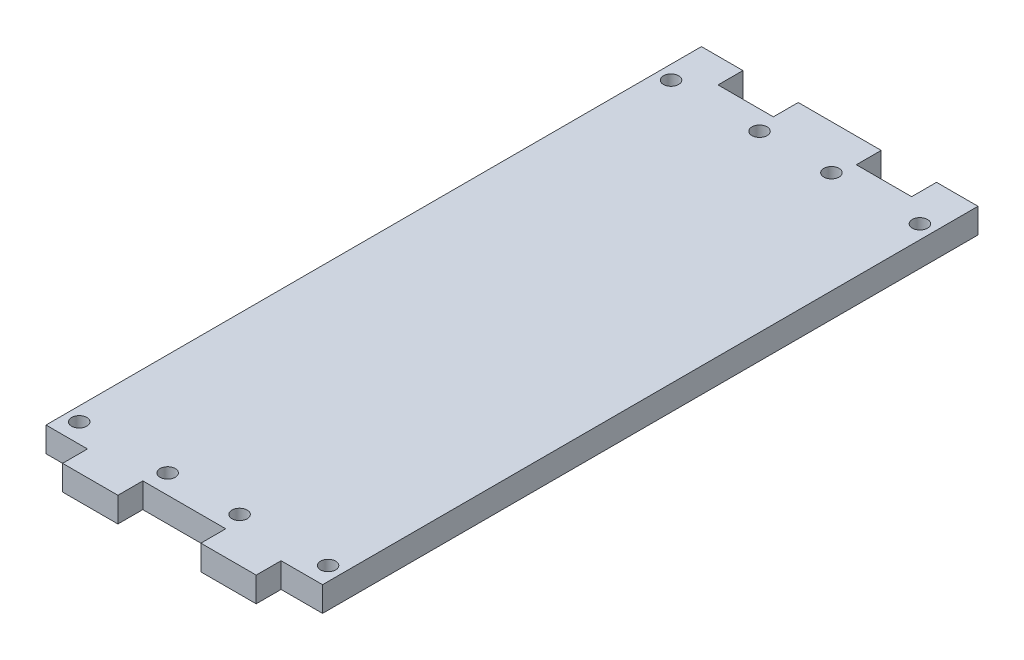
ISO-10303-21;
HEADER;
FILE_DESCRIPTION(('STEP AP214'),'2;1');
FILE_NAME('part.step','',(''),(''),'','','');
FILE_SCHEMA(('AUTOMOTIVE_DESIGN { 1 0 10303 214 1 1 1 1 }'));
ENDSEC;
DATA;
#1=APPLICATION_CONTEXT('core data for automotive mechanical design processes');
#2=APPLICATION_PROTOCOL_DEFINITION('international standard','automotive_design',2000,#1);
#3=PRODUCT_CONTEXT('',#1,'mechanical');
#4=PRODUCT('Part','Part','',(#3));
#5=PRODUCT_RELATED_PRODUCT_CATEGORY('part','',(#4));
#6=PRODUCT_DEFINITION_FORMATION('','',#4);
#7=PRODUCT_DEFINITION_CONTEXT('part definition',#1,'design');
#8=PRODUCT_DEFINITION('design','',#6,#7);
#9=PRODUCT_DEFINITION_SHAPE('','',#8);
#10=(LENGTH_UNIT() NAMED_UNIT(*) SI_UNIT(.MILLI.,.METRE.));
#11=(NAMED_UNIT(*) PLANE_ANGLE_UNIT() SI_UNIT($,.RADIAN.));
#12=(NAMED_UNIT(*) SI_UNIT($,.STERADIAN.) SOLID_ANGLE_UNIT());
#13=UNCERTAINTY_MEASURE_WITH_UNIT(LENGTH_MEASURE(1.E-05),#10,'distance_accuracy_value','');
#14=(GEOMETRIC_REPRESENTATION_CONTEXT(3) GLOBAL_UNCERTAINTY_ASSIGNED_CONTEXT((#13)) GLOBAL_UNIT_ASSIGNED_CONTEXT((#10,
#11,#12)) REPRESENTATION_CONTEXT('',''));
#15=CARTESIAN_POINT('',(0.,0.,0.));
#16=DIRECTION('',(0.,0.,1.));
#17=DIRECTION('',(1.,0.,0.));
#18=AXIS2_PLACEMENT_3D('',#15,#16,#17);
#19=CARTESIAN_POINT('',(15.,9.,0.));
#20=DIRECTION('',(1.,0.,0.));
#21=DIRECTION('',(0.,0.,-1.));
#22=AXIS2_PLACEMENT_3D('',#19,#20,#21);
#23=PLANE('',#22);
#24=DIRECTION('',(0.,0.,1.));
#25=VECTOR('',#24,1.);
#26=CARTESIAN_POINT('',(15.,0.,0.));
#27=LINE('',#26,#25);
#28=CARTESIAN_POINT('',(15.0000000000001,0.,118.5));
#29=VERTEX_POINT('',#28);
#30=CARTESIAN_POINT('',(15.0000000000001,0.,127.5));
#31=VERTEX_POINT('',#30);
#32=EDGE_CURVE('E412',#29,#31,#27,.T.);
#33=ORIENTED_EDGE('',*,*,#32,.T.);
#34=DIRECTION('',(0.,-1.,0.));
#35=VECTOR('',#34,1.);
#36=CARTESIAN_POINT('',(15.0000000000001,9.,127.5));
#37=LINE('',#36,#35);
#38=CARTESIAN_POINT('',(15.0000000000001,9.,127.5));
#39=VERTEX_POINT('',#38);
#40=EDGE_CURVE('E424',#39,#31,#37,.T.);
#41=ORIENTED_EDGE('',*,*,#40,.F.);
#42=DIRECTION('',(0.,0.,1.));
#43=VECTOR('',#42,1.);
#44=CARTESIAN_POINT('',(15.,9.,0.));
#45=LINE('',#44,#43);
#46=CARTESIAN_POINT('',(15.0000000000001,9.,118.5));
#47=VERTEX_POINT('',#46);
#48=EDGE_CURVE('E761',#47,#39,#45,.T.);
#49=ORIENTED_EDGE('',*,*,#48,.F.);
#50=DIRECTION('',(0.,-1.,0.));
#51=VECTOR('',#50,1.);
#52=CARTESIAN_POINT('',(15.0000000000001,9.,118.5));
#53=LINE('',#52,#51);
#54=EDGE_CURVE('E140',#47,#29,#53,.T.);
#55=ORIENTED_EDGE('',*,*,#54,.T.);
#56=EDGE_LOOP('',(#33,#41,#49,#55));
#57=FACE_BOUND('',#56,.T.);
#58=ADVANCED_FACE('F130',(#57),#23,.F.);
#59=CARTESIAN_POINT('',(0.,9.,127.5));
#60=DIRECTION('',(0.,0.,1.));
#61=DIRECTION('',(1.,0.,0.));
#62=AXIS2_PLACEMENT_3D('',#59,#60,#61);
#63=PLANE('',#62);
#64=DIRECTION('',(-1.,0.,0.));
#65=VECTOR('',#64,1.);
#66=CARTESIAN_POINT('',(0.,0.,127.5));
#67=LINE('',#66,#65);
#68=CARTESIAN_POINT('',(35.0000000000001,0.,127.5));
#69=VERTEX_POINT('',#68);
#70=EDGE_CURVE('E413',#69,#31,#67,.T.);
#71=ORIENTED_EDGE('',*,*,#70,.F.);
#72=DIRECTION('',(0.,-1.,0.));
#73=VECTOR('',#72,1.);
#74=CARTESIAN_POINT('',(35.0000000000001,9.,127.5));
#75=LINE('',#74,#73);
#76=CARTESIAN_POINT('',(35.0000000000001,9.,127.5));
#77=VERTEX_POINT('',#76);
#78=EDGE_CURVE('E149',#77,#69,#75,.T.);
#79=ORIENTED_EDGE('',*,*,#78,.F.);
#80=DIRECTION('',(-1.,0.,0.));
#81=VECTOR('',#80,1.);
#82=CARTESIAN_POINT('',(0.,9.,127.5));
#83=LINE('',#82,#81);
#84=EDGE_CURVE('E425',#77,#39,#83,.T.);
#85=ORIENTED_EDGE('',*,*,#84,.T.);
#86=ORIENTED_EDGE('',*,*,#40,.T.);
#87=EDGE_LOOP('',(#71,#79,#85,#86));
#88=FACE_BOUND('',#87,.T.);
#89=ADVANCED_FACE('F489',(#88),#63,.T.);
#90=CARTESIAN_POINT('',(35.0000000000001,9.,0.));
#91=DIRECTION('',(1.,0.,0.));
#92=DIRECTION('',(0.,0.,-1.));
#93=AXIS2_PLACEMENT_3D('',#90,#91,#92);
#94=PLANE('',#93);
#95=DIRECTION('',(0.,0.,1.));
#96=VECTOR('',#95,1.);
#97=CARTESIAN_POINT('',(35.0000000000001,0.,0.));
#98=LINE('',#97,#96);
#99=CARTESIAN_POINT('',(35.0000000000001,0.,118.5));
#100=VERTEX_POINT('',#99);
#101=EDGE_CURVE('E416',#100,#69,#98,.T.);
#102=ORIENTED_EDGE('',*,*,#101,.F.);
#103=DIRECTION('',(0.,-1.,0.));
#104=VECTOR('',#103,1.);
#105=CARTESIAN_POINT('',(35.0000000000001,9.,118.5));
#106=LINE('',#105,#104);
#107=CARTESIAN_POINT('',(35.0000000000001,9.,118.5));
#108=VERTEX_POINT('',#107);
#109=EDGE_CURVE('E12',#108,#100,#106,.T.);
#110=ORIENTED_EDGE('',*,*,#109,.F.);
#111=DIRECTION('',(0.,0.,1.));
#112=VECTOR('',#111,1.);
#113=CARTESIAN_POINT('',(35.0000000000001,9.,0.));
#114=LINE('',#113,#112);
#115=EDGE_CURVE('E395',#108,#77,#114,.T.);
#116=ORIENTED_EDGE('',*,*,#115,.T.);
#117=ORIENTED_EDGE('',*,*,#78,.T.);
#118=EDGE_LOOP('',(#102,#110,#116,#117));
#119=FACE_BOUND('',#118,.T.);
#120=ADVANCED_FACE('F494',(#119),#94,.T.);
#121=CARTESIAN_POINT('',(0.,0.,0.));
#122=DIRECTION('',(0.,1.,0.));
#123=DIRECTION('',(0.,0.,1.));
#124=AXIS2_PLACEMENT_3D('',#121,#122,#123);
#125=PLANE('',#124);
#126=CARTESIAN_POINT('',(-13.,0.,111.5));
#127=DIRECTION('',(0.,1.,0.));
#128=DIRECTION('',(0.,0.,1.));
#129=AXIS2_PLACEMENT_3D('',#126,#127,#128);
#130=CIRCLE('',#129,2.75);
#131=CARTESIAN_POINT('',(-13.,0.,114.25));
#132=VERTEX_POINT('',#131);
#133=EDGE_CURVE('E726',#132,#132,#130,.T.);
#134=ORIENTED_EDGE('',*,*,#133,.T.);
#135=EDGE_LOOP('',(#134));
#136=FACE_BOUND('',#135,.T.);
#137=CARTESIAN_POINT('',(13.0000000000001,0.,111.5));
#138=DIRECTION('',(0.,1.,0.));
#139=DIRECTION('',(0.,0.,1.));
#140=AXIS2_PLACEMENT_3D('',#137,#138,#139);
#141=CIRCLE('',#140,2.75);
#142=CARTESIAN_POINT('',(13.0000000000001,0.,114.25));
#143=VERTEX_POINT('',#142);
#144=EDGE_CURVE('E730',#143,#143,#141,.T.);
#145=ORIENTED_EDGE('',*,*,#144,.T.);
#146=EDGE_LOOP('',(#145));
#147=FACE_BOUND('',#146,.T.);
#148=CARTESIAN_POINT('',(45.0000000000001,0.,111.5));
#149=DIRECTION('',(0.,1.,0.));
#150=DIRECTION('',(0.,0.,1.));
#151=AXIS2_PLACEMENT_3D('',#148,#149,#150);
#152=CIRCLE('',#151,2.75);
#153=CARTESIAN_POINT('',(45.0000000000001,0.,114.25));
#154=VERTEX_POINT('',#153);
#155=EDGE_CURVE('E734',#154,#154,#152,.T.);
#156=ORIENTED_EDGE('',*,*,#155,.T.);
#157=EDGE_LOOP('',(#156));
#158=FACE_BOUND('',#157,.T.);
#159=CARTESIAN_POINT('',(-45.0000000000001,0.,-102.5));
#160=DIRECTION('',(0.,1.,0.));
#161=DIRECTION('',(0.,0.,1.));
#162=AXIS2_PLACEMENT_3D('',#159,#160,#161);
#163=CIRCLE('',#162,2.75);
#164=CARTESIAN_POINT('',(-45.0000000000001,0.,-99.75));
#165=VERTEX_POINT('',#164);
#166=EDGE_CURVE('E738',#165,#165,#163,.T.);
#167=ORIENTED_EDGE('',*,*,#166,.T.);
#168=EDGE_LOOP('',(#167));
#169=FACE_BOUND('',#168,.T.);
#170=CARTESIAN_POINT('',(-13.0000000000001,0.,-102.5));
#171=DIRECTION('',(0.,1.,0.));
#172=DIRECTION('',(0.,0.,1.));
#173=AXIS2_PLACEMENT_3D('',#170,#171,#172);
#174=CIRCLE('',#173,2.75);
#175=CARTESIAN_POINT('',(-13.0000000000001,0.,-99.75));
#176=VERTEX_POINT('',#175);
#177=EDGE_CURVE('E742',#176,#176,#174,.T.);
#178=ORIENTED_EDGE('',*,*,#177,.T.);
#179=EDGE_LOOP('',(#178));
#180=FACE_BOUND('',#179,.T.);
#181=CARTESIAN_POINT('',(13.0000000000001,0.,-102.5));
#182=DIRECTION('',(0.,1.,0.));
#183=DIRECTION('',(0.,0.,1.));
#184=AXIS2_PLACEMENT_3D('',#181,#182,#183);
#185=CIRCLE('',#184,2.75);
#186=CARTESIAN_POINT('',(13.0000000000001,0.,-99.75));
#187=VERTEX_POINT('',#186);
#188=EDGE_CURVE('E746',#187,#187,#185,.T.);
#189=ORIENTED_EDGE('',*,*,#188,.T.);
#190=EDGE_LOOP('',(#189));
#191=FACE_BOUND('',#190,.T.);
#192=CARTESIAN_POINT('',(45.0000000000001,0.,-102.5));
#193=DIRECTION('',(0.,1.,0.));
#194=DIRECTION('',(0.,0.,1.));
#195=AXIS2_PLACEMENT_3D('',#192,#193,#194);
#196=CIRCLE('',#195,2.75);
#197=CARTESIAN_POINT('',(45.0000000000001,0.,-99.75));
#198=VERTEX_POINT('',#197);
#199=EDGE_CURVE('E750',#198,#198,#196,.T.);
#200=ORIENTED_EDGE('',*,*,#199,.T.);
#201=EDGE_LOOP('',(#200));
#202=FACE_BOUND('',#201,.T.);
#203=CARTESIAN_POINT('',(-45.,0.,111.5));
#204=DIRECTION('',(0.,1.,0.));
#205=DIRECTION('',(0.,0.,1.));
#206=AXIS2_PLACEMENT_3D('',#203,#204,#205);
#207=CIRCLE('',#206,2.75);
#208=CARTESIAN_POINT('',(-45.,0.,114.25));
#209=VERTEX_POINT('',#208);
#210=EDGE_CURVE('E277',#209,#209,#207,.T.);
#211=ORIENTED_EDGE('',*,*,#210,.T.);
#212=EDGE_LOOP('',(#211));
#213=FACE_BOUND('',#212,.T.);
#214=ORIENTED_EDGE('',*,*,#101,.T.);
#215=ORIENTED_EDGE('',*,*,#70,.T.);
#216=ORIENTED_EDGE('',*,*,#32,.F.);
#217=DIRECTION('',(1.,0.,0.));
#218=VECTOR('',#217,1.);
#219=CARTESIAN_POINT('',(-50.,0.,118.5));
#220=LINE('',#219,#218);
#221=CARTESIAN_POINT('',(-15.,0.,118.5));
#222=VERTEX_POINT('',#221);
#223=EDGE_CURVE('E354',#222,#29,#220,.T.);
#224=ORIENTED_EDGE('',*,*,#223,.F.);
#225=DIRECTION('',(0.,0.,1.));
#226=VECTOR('',#225,1.);
#227=CARTESIAN_POINT('',(-15.,0.,118.5));
#228=LINE('',#227,#226);
#229=CARTESIAN_POINT('',(-15.,0.,127.5));
#230=VERTEX_POINT('',#229);
#231=EDGE_CURVE('E432',#222,#230,#228,.T.);
#232=ORIENTED_EDGE('',*,*,#231,.T.);
#233=DIRECTION('',(1.,0.,0.));
#234=VECTOR('',#233,1.);
#235=CARTESIAN_POINT('',(-35.,0.,127.5));
#236=LINE('',#235,#234);
#237=CARTESIAN_POINT('',(-35.,0.,127.5));
#238=VERTEX_POINT('',#237);
#239=EDGE_CURVE('E440',#238,#230,#236,.T.);
#240=ORIENTED_EDGE('',*,*,#239,.F.);
#241=DIRECTION('',(0.,0.,1.));
#242=VECTOR('',#241,1.);
#243=CARTESIAN_POINT('',(-35.,0.,118.5));
#244=LINE('',#243,#242);
#245=CARTESIAN_POINT('',(-35.,0.,118.5));
#246=VERTEX_POINT('',#245);
#247=EDGE_CURVE('E358',#246,#238,#244,.T.);
#248=ORIENTED_EDGE('',*,*,#247,.F.);
#249=CARTESIAN_POINT('',(-50.,0.,118.5));
#250=VERTEX_POINT('',#249);
#251=EDGE_CURVE('E350',#250,#246,#220,.T.);
#252=ORIENTED_EDGE('',*,*,#251,.F.);
#253=DIRECTION('',(0.,0.,1.));
#254=VECTOR('',#253,1.);
#255=CARTESIAN_POINT('',(-49.9999999999999,0.,-118.5));
#256=LINE('',#255,#254);
#257=CARTESIAN_POINT('',(-49.9999999999999,0.,-118.5));
#258=VERTEX_POINT('',#257);
#259=EDGE_CURVE('E353',#258,#250,#256,.T.);
#260=ORIENTED_EDGE('',*,*,#259,.F.);
#261=DIRECTION('',(1.,0.,0.));
#262=VECTOR('',#261,1.);
#263=CARTESIAN_POINT('',(-49.9999999999999,0.,-118.5));
#264=LINE('',#263,#262);
#265=CARTESIAN_POINT('',(-35.,0.,-118.5));
#266=VERTEX_POINT('',#265);
#267=EDGE_CURVE('E343',#258,#266,#264,.T.);
#268=ORIENTED_EDGE('',*,*,#267,.T.);
#269=DIRECTION('',(0.,0.,1.));
#270=VECTOR('',#269,1.);
#271=CARTESIAN_POINT('',(-35.,0.,0.));
#272=LINE('',#271,#270);
#273=CARTESIAN_POINT('',(-35.,0.,-109.5));
#274=VERTEX_POINT('',#273);
#275=EDGE_CURVE('E276',#266,#274,#272,.T.);
#276=ORIENTED_EDGE('',*,*,#275,.T.);
#277=DIRECTION('',(1.,0.,0.));
#278=VECTOR('',#277,1.);
#279=CARTESIAN_POINT('',(0.,0.,-109.5));
#280=LINE('',#279,#278);
#281=CARTESIAN_POINT('',(-15.,0.,-109.5));
#282=VERTEX_POINT('',#281);
#283=EDGE_CURVE('E283',#274,#282,#280,.T.);
#284=ORIENTED_EDGE('',*,*,#283,.T.);
#285=DIRECTION('',(0.,0.,1.));
#286=VECTOR('',#285,1.);
#287=CARTESIAN_POINT('',(-15.,0.,0.));
#288=LINE('',#287,#286);
#289=CARTESIAN_POINT('',(-15.,0.,-118.5));
#290=VERTEX_POINT('',#289);
#291=EDGE_CURVE('E266',#290,#282,#288,.T.);
#292=ORIENTED_EDGE('',*,*,#291,.F.);
#293=CARTESIAN_POINT('',(15.,0.,-118.5));
#294=VERTEX_POINT('',#293);
#295=EDGE_CURVE('E346',#290,#294,#264,.T.);
#296=ORIENTED_EDGE('',*,*,#295,.T.);
#297=DIRECTION('',(0.,0.,1.));
#298=VECTOR('',#297,1.);
#299=CARTESIAN_POINT('',(15.0000000000001,0.,0.));
#300=LINE('',#299,#298);
#301=CARTESIAN_POINT('',(15.,0.,-109.5));
#302=VERTEX_POINT('',#301);
#303=EDGE_CURVE('E314',#294,#302,#300,.T.);
#304=ORIENTED_EDGE('',*,*,#303,.T.);
#305=DIRECTION('',(-1.,0.,0.));
#306=VECTOR('',#305,1.);
#307=CARTESIAN_POINT('',(0.,0.,-109.5));
#308=LINE('',#307,#306);
#309=CARTESIAN_POINT('',(35.,0.,-109.5));
#310=VERTEX_POINT('',#309);
#311=EDGE_CURVE('E307',#310,#302,#308,.T.);
#312=ORIENTED_EDGE('',*,*,#311,.F.);
#313=DIRECTION('',(0.,0.,1.));
#314=VECTOR('',#313,1.);
#315=CARTESIAN_POINT('',(35.,0.,0.));
#316=LINE('',#315,#314);
#317=CARTESIAN_POINT('',(35.,0.,-118.5));
#318=VERTEX_POINT('',#317);
#319=EDGE_CURVE('E260',#318,#310,#316,.T.);
#320=ORIENTED_EDGE('',*,*,#319,.F.);
#321=CARTESIAN_POINT('',(50.,0.,-118.5));
#322=VERTEX_POINT('',#321);
#323=EDGE_CURVE('E327',#318,#322,#264,.T.);
#324=ORIENTED_EDGE('',*,*,#323,.T.);
#325=DIRECTION('',(0.,0.,1.));
#326=VECTOR('',#325,1.);
#327=CARTESIAN_POINT('',(50.,0.,-118.5));
#328=LINE('',#327,#326);
#329=CARTESIAN_POINT('',(50.,0.,118.5));
#330=VERTEX_POINT('',#329);
#331=EDGE_CURVE('E345',#322,#330,#328,.T.);
#332=ORIENTED_EDGE('',*,*,#331,.T.);
#333=EDGE_CURVE('E349',#100,#330,#220,.T.);
#334=ORIENTED_EDGE('',*,*,#333,.F.);
#335=EDGE_LOOP('',(#214,#215,#216,#224,#232,#240,#248,#252,#260,#268,#276,#284,#292,#296,#304,
#312,#320,#324,#332,#334));
#336=FACE_BOUND('',#335,.T.);
#337=ADVANCED_FACE('F290',(#136,#147,#158,#169,#180,#191,#202,#213,#336),#125,.F.);
#338=CARTESIAN_POINT('',(0.,9.,0.));
#339=DIRECTION('',(0.,1.,0.));
#340=DIRECTION('',(0.,0.,1.));
#341=AXIS2_PLACEMENT_3D('',#338,#339,#340);
#342=PLANE('',#341);
#343=CARTESIAN_POINT('',(-13.,9.,111.5));
#344=DIRECTION('',(0.,1.,0.));
#345=DIRECTION('',(0.,0.,1.));
#346=AXIS2_PLACEMENT_3D('',#343,#344,#345);
#347=CIRCLE('',#346,2.75);
#348=CARTESIAN_POINT('',(-13.,9.,114.25));
#349=VERTEX_POINT('',#348);
#350=EDGE_CURVE('E770',#349,#349,#347,.T.);
#351=ORIENTED_EDGE('',*,*,#350,.F.);
#352=EDGE_LOOP('',(#351));
#353=FACE_BOUND('',#352,.T.);
#354=CARTESIAN_POINT('',(13.0000000000001,9.,111.5));
#355=DIRECTION('',(0.,1.,0.));
#356=DIRECTION('',(0.,0.,-1.));
#357=AXIS2_PLACEMENT_3D('',#354,#355,#356);
#358=CIRCLE('',#357,2.75);
#359=CARTESIAN_POINT('',(13.0000000000001,9.,108.75));
#360=VERTEX_POINT('',#359);
#361=EDGE_CURVE('E786',#360,#360,#358,.T.);
#362=ORIENTED_EDGE('',*,*,#361,.F.);
#363=EDGE_LOOP('',(#362));
#364=FACE_BOUND('',#363,.T.);
#365=CARTESIAN_POINT('',(45.0000000000001,9.,111.5));
#366=DIRECTION('',(0.,1.,0.));
#367=DIRECTION('',(0.,0.,-1.));
#368=AXIS2_PLACEMENT_3D('',#365,#366,#367);
#369=CIRCLE('',#368,2.75);
#370=CARTESIAN_POINT('',(45.0000000000001,9.,108.75));
#371=VERTEX_POINT('',#370);
#372=EDGE_CURVE('E783',#371,#371,#369,.T.);
#373=ORIENTED_EDGE('',*,*,#372,.F.);
#374=EDGE_LOOP('',(#373));
#375=FACE_BOUND('',#374,.T.);
#376=CARTESIAN_POINT('',(-45.0000000000001,9.,-102.5));
#377=DIRECTION('',(0.,1.,0.));
#378=DIRECTION('',(0.,0.,-1.));
#379=AXIS2_PLACEMENT_3D('',#376,#377,#378);
#380=CIRCLE('',#379,2.75);
#381=CARTESIAN_POINT('',(-45.0000000000001,9.,-105.25));
#382=VERTEX_POINT('',#381);
#383=EDGE_CURVE('E780',#382,#382,#380,.T.);
#384=ORIENTED_EDGE('',*,*,#383,.F.);
#385=EDGE_LOOP('',(#384));
#386=FACE_BOUND('',#385,.T.);
#387=CARTESIAN_POINT('',(-13.0000000000001,9.,-102.5));
#388=DIRECTION('',(0.,1.,0.));
#389=DIRECTION('',(0.,0.,-1.));
#390=AXIS2_PLACEMENT_3D('',#387,#388,#389);
#391=CIRCLE('',#390,2.75);
#392=CARTESIAN_POINT('',(-13.0000000000001,9.,-105.25));
#393=VERTEX_POINT('',#392);
#394=EDGE_CURVE('E777',#393,#393,#391,.T.);
#395=ORIENTED_EDGE('',*,*,#394,.F.);
#396=EDGE_LOOP('',(#395));
#397=FACE_BOUND('',#396,.T.);
#398=CARTESIAN_POINT('',(13.0000000000001,9.,-102.5));
#399=DIRECTION('',(0.,1.,0.));
#400=DIRECTION('',(0.,0.,1.));
#401=AXIS2_PLACEMENT_3D('',#398,#399,#400);
#402=CIRCLE('',#401,2.75);
#403=CARTESIAN_POINT('',(13.0000000000001,9.,-99.75));
#404=VERTEX_POINT('',#403);
#405=EDGE_CURVE('E774',#404,#404,#402,.T.);
#406=ORIENTED_EDGE('',*,*,#405,.F.);
#407=EDGE_LOOP('',(#406));
#408=FACE_BOUND('',#407,.T.);
#409=CARTESIAN_POINT('',(45.0000000000001,9.,-102.5));
#410=DIRECTION('',(0.,1.,0.));
#411=DIRECTION('',(0.,0.,1.));
#412=AXIS2_PLACEMENT_3D('',#409,#410,#411);
#413=CIRCLE('',#412,2.75);
#414=CARTESIAN_POINT('',(45.0000000000001,9.,-99.75));
#415=VERTEX_POINT('',#414);
#416=EDGE_CURVE('E771',#415,#415,#413,.T.);
#417=ORIENTED_EDGE('',*,*,#416,.F.);
#418=EDGE_LOOP('',(#417));
#419=FACE_BOUND('',#418,.T.);
#420=CARTESIAN_POINT('',(-45.,9.,111.5));
#421=DIRECTION('',(0.,1.,0.));
#422=DIRECTION('',(0.,0.,1.));
#423=AXIS2_PLACEMENT_3D('',#420,#421,#422);
#424=CIRCLE('',#423,2.75);
#425=CARTESIAN_POINT('',(-45.,9.,114.25));
#426=VERTEX_POINT('',#425);
#427=EDGE_CURVE('E754',#426,#426,#424,.T.);
#428=ORIENTED_EDGE('',*,*,#427,.F.);
#429=EDGE_LOOP('',(#428));
#430=FACE_BOUND('',#429,.T.);
#431=ORIENTED_EDGE('',*,*,#115,.F.);
#432=DIRECTION('',(1.,0.,0.));
#433=VECTOR('',#432,1.);
#434=CARTESIAN_POINT('',(-50.,9.,118.5));
#435=LINE('',#434,#433);
#436=CARTESIAN_POINT('',(50.,9.,118.5));
#437=VERTEX_POINT('',#436);
#438=EDGE_CURVE('E336',#108,#437,#435,.T.);
#439=ORIENTED_EDGE('',*,*,#438,.T.);
#440=DIRECTION('',(0.,0.,1.));
#441=VECTOR('',#440,1.);
#442=CARTESIAN_POINT('',(50.,9.,-118.5));
#443=LINE('',#442,#441);
#444=CARTESIAN_POINT('',(50.,9.,-118.5));
#445=VERTEX_POINT('',#444);
#446=EDGE_CURVE('E331',#445,#437,#443,.T.);
#447=ORIENTED_EDGE('',*,*,#446,.F.);
#448=DIRECTION('',(1.,0.,0.));
#449=VECTOR('',#448,1.);
#450=CARTESIAN_POINT('',(-49.9999999999999,9.,-118.5));
#451=LINE('',#450,#449);
#452=CARTESIAN_POINT('',(35.,9.,-118.5));
#453=VERTEX_POINT('',#452);
#454=EDGE_CURVE('E333',#453,#445,#451,.T.);
#455=ORIENTED_EDGE('',*,*,#454,.F.);
#456=DIRECTION('',(0.,0.,1.));
#457=VECTOR('',#456,1.);
#458=CARTESIAN_POINT('',(35.,9.,0.));
#459=LINE('',#458,#457);
#460=CARTESIAN_POINT('',(35.,9.,-109.5));
#461=VERTEX_POINT('',#460);
#462=EDGE_CURVE('E303',#453,#461,#459,.T.);
#463=ORIENTED_EDGE('',*,*,#462,.T.);
#464=DIRECTION('',(-1.,0.,0.));
#465=VECTOR('',#464,1.);
#466=CARTESIAN_POINT('',(0.,9.,-109.5));
#467=LINE('',#466,#465);
#468=CARTESIAN_POINT('',(15.,9.,-109.5));
#469=VERTEX_POINT('',#468);
#470=EDGE_CURVE('E309',#461,#469,#467,.T.);
#471=ORIENTED_EDGE('',*,*,#470,.T.);
#472=DIRECTION('',(0.,0.,1.));
#473=VECTOR('',#472,1.);
#474=CARTESIAN_POINT('',(15.0000000000001,9.,0.));
#475=LINE('',#474,#473);
#476=CARTESIAN_POINT('',(15.,9.,-118.5));
#477=VERTEX_POINT('',#476);
#478=EDGE_CURVE('E306',#477,#469,#475,.T.);
#479=ORIENTED_EDGE('',*,*,#478,.F.);
#480=CARTESIAN_POINT('',(-15.,9.,-118.5));
#481=VERTEX_POINT('',#480);
#482=EDGE_CURVE('E332',#481,#477,#451,.T.);
#483=ORIENTED_EDGE('',*,*,#482,.F.);
#484=DIRECTION('',(0.,0.,1.));
#485=VECTOR('',#484,1.);
#486=CARTESIAN_POINT('',(-15.,9.,0.));
#487=LINE('',#486,#485);
#488=CARTESIAN_POINT('',(-15.,9.,-109.5));
#489=VERTEX_POINT('',#488);
#490=EDGE_CURVE('E292',#481,#489,#487,.T.);
#491=ORIENTED_EDGE('',*,*,#490,.T.);
#492=DIRECTION('',(1.,0.,0.));
#493=VECTOR('',#492,1.);
#494=CARTESIAN_POINT('',(0.,9.,-109.5));
#495=LINE('',#494,#493);
#496=CARTESIAN_POINT('',(-35.,9.,-109.5));
#497=VERTEX_POINT('',#496);
#498=EDGE_CURVE('E286',#497,#489,#495,.T.);
#499=ORIENTED_EDGE('',*,*,#498,.F.);
#500=DIRECTION('',(0.,0.,1.));
#501=VECTOR('',#500,1.);
#502=CARTESIAN_POINT('',(-35.,9.,0.));
#503=LINE('',#502,#501);
#504=CARTESIAN_POINT('',(-35.,9.,-118.5));
#505=VERTEX_POINT('',#504);
#506=EDGE_CURVE('E294',#505,#497,#503,.T.);
#507=ORIENTED_EDGE('',*,*,#506,.F.);
#508=CARTESIAN_POINT('',(-49.9999999999999,9.,-118.5));
#509=VERTEX_POINT('',#508);
#510=EDGE_CURVE('E328',#509,#505,#451,.T.);
#511=ORIENTED_EDGE('',*,*,#510,.F.);
#512=DIRECTION('',(0.,0.,1.));
#513=VECTOR('',#512,1.);
#514=CARTESIAN_POINT('',(-49.9999999999999,9.,-118.5));
#515=LINE('',#514,#513);
#516=CARTESIAN_POINT('',(-50.,9.,118.5));
#517=VERTEX_POINT('',#516);
#518=EDGE_CURVE('E340',#509,#517,#515,.T.);
#519=ORIENTED_EDGE('',*,*,#518,.T.);
#520=CARTESIAN_POINT('',(-35.,9.,118.5));
#521=VERTEX_POINT('',#520);
#522=EDGE_CURVE('E337',#517,#521,#435,.T.);
#523=ORIENTED_EDGE('',*,*,#522,.T.);
#524=DIRECTION('',(0.,0.,1.));
#525=VECTOR('',#524,1.);
#526=CARTESIAN_POINT('',(-35.,9.,118.5));
#527=LINE('',#526,#525);
#528=CARTESIAN_POINT('',(-35.,9.,127.5));
#529=VERTEX_POINT('',#528);
#530=EDGE_CURVE('E428',#521,#529,#527,.T.);
#531=ORIENTED_EDGE('',*,*,#530,.T.);
#532=DIRECTION('',(1.,0.,0.));
#533=VECTOR('',#532,1.);
#534=CARTESIAN_POINT('',(-35.,9.,127.5));
#535=LINE('',#534,#533);
#536=CARTESIAN_POINT('',(-15.,9.,127.5));
#537=VERTEX_POINT('',#536);
#538=EDGE_CURVE('E431',#529,#537,#535,.T.);
#539=ORIENTED_EDGE('',*,*,#538,.T.);
#540=DIRECTION('',(0.,0.,1.));
#541=VECTOR('',#540,1.);
#542=CARTESIAN_POINT('',(-15.,9.,118.5));
#543=LINE('',#542,#541);
#544=CARTESIAN_POINT('',(-15.,9.,118.5));
#545=VERTEX_POINT('',#544);
#546=EDGE_CURVE('E434',#545,#537,#543,.T.);
#547=ORIENTED_EDGE('',*,*,#546,.F.);
#548=EDGE_CURVE('E341',#545,#47,#435,.T.);
#549=ORIENTED_EDGE('',*,*,#548,.T.);
#550=ORIENTED_EDGE('',*,*,#48,.T.);
#551=ORIENTED_EDGE('',*,*,#84,.F.);
#552=EDGE_LOOP('',(#431,#439,#447,#455,#463,#471,#479,#483,#491,#499,#507,#511,#519,#523,#531,
#539,#547,#549,#550,#551));
#553=FACE_BOUND('',#552,.T.);
#554=ADVANCED_FACE('F388',(#353,#364,#375,#386,#397,#408,#419,#430,#553),#342,.T.);
#555=CARTESIAN_POINT('',(-35.,9.,127.5));
#556=DIRECTION('',(0.,0.,-1.));
#557=DIRECTION('',(-1.,0.,0.));
#558=AXIS2_PLACEMENT_3D('',#555,#556,#557);
#559=PLANE('',#558);
#560=ORIENTED_EDGE('',*,*,#239,.T.);
#561=DIRECTION('',(0.,-1.,0.));
#562=VECTOR('',#561,1.);
#563=CARTESIAN_POINT('',(-15.,9.,127.5));
#564=LINE('',#563,#562);
#565=EDGE_CURVE('E446',#537,#230,#564,.T.);
#566=ORIENTED_EDGE('',*,*,#565,.F.);
#567=ORIENTED_EDGE('',*,*,#538,.F.);
#568=DIRECTION('',(0.,-1.,0.));
#569=VECTOR('',#568,1.);
#570=CARTESIAN_POINT('',(-35.,9.,127.5));
#571=LINE('',#570,#569);
#572=EDGE_CURVE('E419',#529,#238,#571,.T.);
#573=ORIENTED_EDGE('',*,*,#572,.T.);
#574=EDGE_LOOP('',(#560,#566,#567,#573));
#575=FACE_BOUND('',#574,.T.);
#576=ADVANCED_FACE('F471',(#575),#559,.F.);
#577=CARTESIAN_POINT('',(-35.,9.,118.5));
#578=DIRECTION('',(1.,0.,0.));
#579=DIRECTION('',(0.,0.,-1.));
#580=AXIS2_PLACEMENT_3D('',#577,#578,#579);
#581=PLANE('',#580);
#582=ORIENTED_EDGE('',*,*,#247,.T.);
#583=ORIENTED_EDGE('',*,*,#572,.F.);
#584=ORIENTED_EDGE('',*,*,#530,.F.);
#585=DIRECTION('',(0.,-1.,0.));
#586=VECTOR('',#585,1.);
#587=CARTESIAN_POINT('',(-35.,9.,118.5));
#588=LINE('',#587,#586);
#589=EDGE_CURVE('E437',#521,#246,#588,.T.);
#590=ORIENTED_EDGE('',*,*,#589,.T.);
#591=EDGE_LOOP('',(#582,#583,#584,#590));
#592=FACE_BOUND('',#591,.T.);
#593=ADVANCED_FACE('F468',(#592),#581,.F.);
#594=CARTESIAN_POINT('',(-15.,9.,118.5));
#595=DIRECTION('',(1.,0.,0.));
#596=DIRECTION('',(0.,0.,-1.));
#597=AXIS2_PLACEMENT_3D('',#594,#595,#596);
#598=PLANE('',#597);
#599=ORIENTED_EDGE('',*,*,#231,.F.);
#600=DIRECTION('',(0.,-1.,0.));
#601=VECTOR('',#600,1.);
#602=CARTESIAN_POINT('',(-15.,9.,118.5));
#603=LINE('',#602,#601);
#604=EDGE_CURVE('E407',#545,#222,#603,.T.);
#605=ORIENTED_EDGE('',*,*,#604,.F.);
#606=ORIENTED_EDGE('',*,*,#546,.T.);
#607=ORIENTED_EDGE('',*,*,#565,.T.);
#608=EDGE_LOOP('',(#599,#605,#606,#607));
#609=FACE_BOUND('',#608,.T.);
#610=ADVANCED_FACE('F476',(#609),#598,.T.);
#611=CARTESIAN_POINT('',(0.,9.,-109.5));
#612=DIRECTION('',(0.,0.,-1.));
#613=DIRECTION('',(-1.,0.,0.));
#614=AXIS2_PLACEMENT_3D('',#611,#612,#613);
#615=PLANE('',#614);
#616=ORIENTED_EDGE('',*,*,#283,.F.);
#617=DIRECTION('',(0.,-1.,0.));
#618=VECTOR('',#617,1.);
#619=CARTESIAN_POINT('',(-35.,9.,-109.5));
#620=LINE('',#619,#618);
#621=EDGE_CURVE('E287',#497,#274,#620,.T.);
#622=ORIENTED_EDGE('',*,*,#621,.F.);
#623=ORIENTED_EDGE('',*,*,#498,.T.);
#624=DIRECTION('',(0.,-1.,0.));
#625=VECTOR('',#624,1.);
#626=CARTESIAN_POINT('',(-15.,9.,-109.5));
#627=LINE('',#626,#625);
#628=EDGE_CURVE('E269',#489,#282,#627,.T.);
#629=ORIENTED_EDGE('',*,*,#628,.T.);
#630=EDGE_LOOP('',(#616,#622,#623,#629));
#631=FACE_BOUND('',#630,.T.);
#632=ADVANCED_FACE('F281',(#631),#615,.T.);
#633=CARTESIAN_POINT('',(-35.,9.,0.));
#634=DIRECTION('',(1.,0.,0.));
#635=DIRECTION('',(0.,0.,-1.));
#636=AXIS2_PLACEMENT_3D('',#633,#634,#635);
#637=PLANE('',#636);
#638=ORIENTED_EDGE('',*,*,#275,.F.);
#639=DIRECTION('',(0.,-1.,0.));
#640=VECTOR('',#639,1.);
#641=CARTESIAN_POINT('',(-35.,9.,-118.5));
#642=LINE('',#641,#640);
#643=EDGE_CURVE('E299',#505,#266,#642,.T.);
#644=ORIENTED_EDGE('',*,*,#643,.F.);
#645=ORIENTED_EDGE('',*,*,#506,.T.);
#646=ORIENTED_EDGE('',*,*,#621,.T.);
#647=EDGE_LOOP('',(#638,#644,#645,#646));
#648=FACE_BOUND('',#647,.T.);
#649=ADVANCED_FACE('F453',(#648),#637,.T.);
#650=CARTESIAN_POINT('',(-49.9999999999999,9.,-118.5));
#651=DIRECTION('',(0.,0.,-1.));
#652=DIRECTION('',(-1.,0.,0.));
#653=AXIS2_PLACEMENT_3D('',#650,#651,#652);
#654=PLANE('',#653);
#655=ORIENTED_EDGE('',*,*,#510,.T.);
#656=ORIENTED_EDGE('',*,*,#643,.T.);
#657=ORIENTED_EDGE('',*,*,#267,.F.);
#658=DIRECTION('',(0.,-1.,0.));
#659=VECTOR('',#658,1.);
#660=CARTESIAN_POINT('',(-49.9999999999999,9.,-118.5));
#661=LINE('',#660,#659);
#662=EDGE_CURVE('E356',#509,#258,#661,.T.);
#663=ORIENTED_EDGE('',*,*,#662,.F.);
#664=EDGE_LOOP('',(#655,#656,#657,#663));
#665=FACE_BOUND('',#664,.T.);
#666=ADVANCED_FACE('F456',(#665),#654,.T.);
#667=CARTESIAN_POINT('',(-49.9999999999999,9.,-118.5));
#668=DIRECTION('',(1.,0.,0.));
#669=DIRECTION('',(0.,0.,-1.));
#670=AXIS2_PLACEMENT_3D('',#667,#668,#669);
#671=PLANE('',#670);
#672=ORIENTED_EDGE('',*,*,#259,.T.);
#673=DIRECTION('',(0.,-1.,0.));
#674=VECTOR('',#673,1.);
#675=CARTESIAN_POINT('',(-50.,9.,118.5));
#676=LINE('',#675,#674);
#677=EDGE_CURVE('E359',#517,#250,#676,.T.);
#678=ORIENTED_EDGE('',*,*,#677,.F.);
#679=ORIENTED_EDGE('',*,*,#518,.F.);
#680=ORIENTED_EDGE('',*,*,#662,.T.);
#681=EDGE_LOOP('',(#672,#678,#679,#680));
#682=FACE_BOUND('',#681,.T.);
#683=ADVANCED_FACE('F462',(#682),#671,.F.);
#684=CARTESIAN_POINT('',(-50.,9.,118.5));
#685=DIRECTION('',(0.,0.,-1.));
#686=DIRECTION('',(-1.,0.,0.));
#687=AXIS2_PLACEMENT_3D('',#684,#685,#686);
#688=PLANE('',#687);
#689=ORIENTED_EDGE('',*,*,#589,.F.);
#690=ORIENTED_EDGE('',*,*,#522,.F.);
#691=ORIENTED_EDGE('',*,*,#677,.T.);
#692=ORIENTED_EDGE('',*,*,#251,.T.);
#693=EDGE_LOOP('',(#689,#690,#691,#692));
#694=FACE_BOUND('',#693,.T.);
#695=ADVANCED_FACE('F478',(#694),#688,.F.);
#696=ORIENTED_EDGE('',*,*,#223,.T.);
#697=ORIENTED_EDGE('',*,*,#54,.F.);
#698=ORIENTED_EDGE('',*,*,#548,.F.);
#699=ORIENTED_EDGE('',*,*,#604,.T.);
#700=EDGE_LOOP('',(#696,#697,#698,#699));
#701=FACE_BOUND('',#700,.T.);
#702=ADVANCED_FACE('F404',(#701),#688,.F.);
#703=ORIENTED_EDGE('',*,*,#438,.F.);
#704=ORIENTED_EDGE('',*,*,#109,.T.);
#705=ORIENTED_EDGE('',*,*,#333,.T.);
#706=DIRECTION('',(0.,-1.,0.));
#707=VECTOR('',#706,1.);
#708=CARTESIAN_POINT('',(50.,9.,118.5));
#709=LINE('',#708,#707);
#710=EDGE_CURVE('E361',#437,#330,#709,.T.);
#711=ORIENTED_EDGE('',*,*,#710,.F.);
#712=EDGE_LOOP('',(#703,#704,#705,#711));
#713=FACE_BOUND('',#712,.T.);
#714=ADVANCED_FACE('F397',(#713),#688,.F.);
#715=CARTESIAN_POINT('',(50.,9.,-118.5));
#716=DIRECTION('',(1.,0.,0.));
#717=DIRECTION('',(0.,0.,-1.));
#718=AXIS2_PLACEMENT_3D('',#715,#716,#717);
#719=PLANE('',#718);
#720=ORIENTED_EDGE('',*,*,#331,.F.);
#721=DIRECTION('',(0.,-1.,0.));
#722=VECTOR('',#721,1.);
#723=CARTESIAN_POINT('',(50.,9.,-118.5));
#724=LINE('',#723,#722);
#725=EDGE_CURVE('E134',#445,#322,#724,.T.);
#726=ORIENTED_EDGE('',*,*,#725,.F.);
#727=ORIENTED_EDGE('',*,*,#446,.T.);
#728=ORIENTED_EDGE('',*,*,#710,.T.);
#729=EDGE_LOOP('',(#720,#726,#727,#728));
#730=FACE_BOUND('',#729,.T.);
#731=ADVANCED_FACE('F373',(#730),#719,.T.);
#732=DIRECTION('',(0.,-1.,0.));
#733=VECTOR('',#732,1.);
#734=CARTESIAN_POINT('',(35.,9.,-118.5));
#735=LINE('',#734,#733);
#736=EDGE_CURVE('E325',#453,#318,#735,.T.);
#737=ORIENTED_EDGE('',*,*,#736,.F.);
#738=ORIENTED_EDGE('',*,*,#454,.T.);
#739=ORIENTED_EDGE('',*,*,#725,.T.);
#740=ORIENTED_EDGE('',*,*,#323,.F.);
#741=EDGE_LOOP('',(#737,#738,#739,#740));
#742=FACE_BOUND('',#741,.T.);
#743=ADVANCED_FACE('F132',(#742),#654,.T.);
#744=CARTESIAN_POINT('',(35.,9.,0.));
#745=DIRECTION('',(1.,0.,0.));
#746=DIRECTION('',(0.,0.,-1.));
#747=AXIS2_PLACEMENT_3D('',#744,#745,#746);
#748=PLANE('',#747);
#749=ORIENTED_EDGE('',*,*,#319,.T.);
#750=DIRECTION('',(0.,-1.,0.));
#751=VECTOR('',#750,1.);
#752=CARTESIAN_POINT('',(35.,9.,-109.5));
#753=LINE('',#752,#751);
#754=EDGE_CURVE('E312',#461,#310,#753,.T.);
#755=ORIENTED_EDGE('',*,*,#754,.F.);
#756=ORIENTED_EDGE('',*,*,#462,.F.);
#757=ORIENTED_EDGE('',*,*,#736,.T.);
#758=EDGE_LOOP('',(#749,#755,#756,#757));
#759=FACE_BOUND('',#758,.T.);
#760=ADVANCED_FACE('F392',(#759),#748,.F.);
#761=CARTESIAN_POINT('',(0.,9.,-109.5));
#762=DIRECTION('',(0.,0.,1.));
#763=DIRECTION('',(1.,0.,0.));
#764=AXIS2_PLACEMENT_3D('',#761,#762,#763);
#765=PLANE('',#764);
#766=ORIENTED_EDGE('',*,*,#311,.T.);
#767=DIRECTION('',(0.,-1.,0.));
#768=VECTOR('',#767,1.);
#769=CARTESIAN_POINT('',(15.,9.,-109.5));
#770=LINE('',#769,#768);
#771=EDGE_CURVE('E320',#469,#302,#770,.T.);
#772=ORIENTED_EDGE('',*,*,#771,.F.);
#773=ORIENTED_EDGE('',*,*,#470,.F.);
#774=ORIENTED_EDGE('',*,*,#754,.T.);
#775=EDGE_LOOP('',(#766,#772,#773,#774));
#776=FACE_BOUND('',#775,.T.);
#777=ADVANCED_FACE('F391',(#776),#765,.F.);
#778=CARTESIAN_POINT('',(15.0000000000001,9.,0.));
#779=DIRECTION('',(1.,0.,0.));
#780=DIRECTION('',(0.,0.,-1.));
#781=AXIS2_PLACEMENT_3D('',#778,#779,#780);
#782=PLANE('',#781);
#783=ORIENTED_EDGE('',*,*,#303,.F.);
#784=DIRECTION('',(0.,-1.,0.));
#785=VECTOR('',#784,1.);
#786=CARTESIAN_POINT('',(15.,9.,-118.5));
#787=LINE('',#786,#785);
#788=EDGE_CURVE('E322',#477,#294,#787,.T.);
#789=ORIENTED_EDGE('',*,*,#788,.F.);
#790=ORIENTED_EDGE('',*,*,#478,.T.);
#791=ORIENTED_EDGE('',*,*,#771,.T.);
#792=EDGE_LOOP('',(#783,#789,#790,#791));
#793=FACE_BOUND('',#792,.T.);
#794=ADVANCED_FACE('F381',(#793),#782,.T.);
#795=DIRECTION('',(0.,-1.,0.));
#796=VECTOR('',#795,1.);
#797=CARTESIAN_POINT('',(-15.,9.,-118.5));
#798=LINE('',#797,#796);
#799=EDGE_CURVE('E272',#481,#290,#798,.T.);
#800=ORIENTED_EDGE('',*,*,#799,.F.);
#801=ORIENTED_EDGE('',*,*,#482,.T.);
#802=ORIENTED_EDGE('',*,*,#788,.T.);
#803=ORIENTED_EDGE('',*,*,#295,.F.);
#804=EDGE_LOOP('',(#800,#801,#802,#803));
#805=FACE_BOUND('',#804,.T.);
#806=ADVANCED_FACE('F384',(#805),#654,.T.);
#807=CARTESIAN_POINT('',(-15.,9.,0.));
#808=DIRECTION('',(1.,0.,0.));
#809=DIRECTION('',(0.,0.,-1.));
#810=AXIS2_PLACEMENT_3D('',#807,#808,#809);
#811=PLANE('',#810);
#812=ORIENTED_EDGE('',*,*,#291,.T.);
#813=ORIENTED_EDGE('',*,*,#628,.F.);
#814=ORIENTED_EDGE('',*,*,#490,.F.);
#815=ORIENTED_EDGE('',*,*,#799,.T.);
#816=EDGE_LOOP('',(#812,#813,#814,#815));
#817=FACE_BOUND('',#816,.T.);
#818=ADVANCED_FACE('F268',(#817),#811,.F.);
#819=CARTESIAN_POINT('',(-45.,-1.,111.5));
#820=DIRECTION('',(0.,1.,0.));
#821=DIRECTION('',(0.,0.,1.));
#822=AXIS2_PLACEMENT_3D('',#819,#820,#821);
#823=CYLINDRICAL_SURFACE('',#822,2.75);
#824=ORIENTED_EDGE('',*,*,#427,.T.);
#825=EDGE_LOOP('',(#824));
#826=FACE_BOUND('',#825,.T.);
#827=ORIENTED_EDGE('',*,*,#210,.F.);
#828=EDGE_LOOP('',(#827));
#829=FACE_BOUND('',#828,.T.);
#830=ADVANCED_FACE('F503',(#826,#829),#823,.F.);
#831=CARTESIAN_POINT('',(45.0000000000001,-1.,-102.5));
#832=DIRECTION('',(0.,1.,0.));
#833=DIRECTION('',(0.,0.,1.));
#834=AXIS2_PLACEMENT_3D('',#831,#832,#833);
#835=CYLINDRICAL_SURFACE('',#834,2.75);
#836=ORIENTED_EDGE('',*,*,#416,.T.);
#837=EDGE_LOOP('',(#836));
#838=FACE_BOUND('',#837,.T.);
#839=ORIENTED_EDGE('',*,*,#199,.F.);
#840=EDGE_LOOP('',(#839));
#841=FACE_BOUND('',#840,.T.);
#842=ADVANCED_FACE('F541',(#838,#841),#835,.F.);
#843=CARTESIAN_POINT('',(13.0000000000001,-1.,-102.5));
#844=DIRECTION('',(0.,1.,0.));
#845=DIRECTION('',(0.,0.,1.));
#846=AXIS2_PLACEMENT_3D('',#843,#844,#845);
#847=CYLINDRICAL_SURFACE('',#846,2.75);
#848=ORIENTED_EDGE('',*,*,#405,.T.);
#849=EDGE_LOOP('',(#848));
#850=FACE_BOUND('',#849,.T.);
#851=ORIENTED_EDGE('',*,*,#188,.F.);
#852=EDGE_LOOP('',(#851));
#853=FACE_BOUND('',#852,.T.);
#854=ADVANCED_FACE('F550',(#850,#853),#847,.F.);
#855=CARTESIAN_POINT('',(-13.0000000000001,-1.,-102.5));
#856=DIRECTION('',(0.,1.,0.));
#857=DIRECTION('',(0.,0.,1.));
#858=AXIS2_PLACEMENT_3D('',#855,#856,#857);
#859=CYLINDRICAL_SURFACE('',#858,2.75);
#860=ORIENTED_EDGE('',*,*,#394,.T.);
#861=EDGE_LOOP('',(#860));
#862=FACE_BOUND('',#861,.T.);
#863=ORIENTED_EDGE('',*,*,#177,.F.);
#864=EDGE_LOOP('',(#863));
#865=FACE_BOUND('',#864,.T.);
#866=ADVANCED_FACE('F558',(#862,#865),#859,.F.);
#867=CARTESIAN_POINT('',(-45.0000000000001,-1.,-102.5));
#868=DIRECTION('',(0.,1.,0.));
#869=DIRECTION('',(0.,0.,1.));
#870=AXIS2_PLACEMENT_3D('',#867,#868,#869);
#871=CYLINDRICAL_SURFACE('',#870,2.75);
#872=ORIENTED_EDGE('',*,*,#383,.T.);
#873=EDGE_LOOP('',(#872));
#874=FACE_BOUND('',#873,.T.);
#875=ORIENTED_EDGE('',*,*,#166,.F.);
#876=EDGE_LOOP('',(#875));
#877=FACE_BOUND('',#876,.T.);
#878=ADVANCED_FACE('F566',(#874,#877),#871,.F.);
#879=CARTESIAN_POINT('',(45.0000000000001,-1.,111.5));
#880=DIRECTION('',(0.,1.,0.));
#881=DIRECTION('',(0.,0.,1.));
#882=AXIS2_PLACEMENT_3D('',#879,#880,#881);
#883=CYLINDRICAL_SURFACE('',#882,2.75);
#884=ORIENTED_EDGE('',*,*,#372,.T.);
#885=EDGE_LOOP('',(#884));
#886=FACE_BOUND('',#885,.T.);
#887=ORIENTED_EDGE('',*,*,#155,.F.);
#888=EDGE_LOOP('',(#887));
#889=FACE_BOUND('',#888,.T.);
#890=ADVANCED_FACE('F574',(#886,#889),#883,.F.);
#891=CARTESIAN_POINT('',(13.0000000000001,-1.,111.5));
#892=DIRECTION('',(0.,1.,0.));
#893=DIRECTION('',(0.,0.,1.));
#894=AXIS2_PLACEMENT_3D('',#891,#892,#893);
#895=CYLINDRICAL_SURFACE('',#894,2.75);
#896=ORIENTED_EDGE('',*,*,#361,.T.);
#897=EDGE_LOOP('',(#896));
#898=FACE_BOUND('',#897,.T.);
#899=ORIENTED_EDGE('',*,*,#144,.F.);
#900=EDGE_LOOP('',(#899));
#901=FACE_BOUND('',#900,.T.);
#902=ADVANCED_FACE('F582',(#898,#901),#895,.F.);
#903=CARTESIAN_POINT('',(-13.,-1.,111.5));
#904=DIRECTION('',(0.,1.,0.));
#905=DIRECTION('',(0.,0.,1.));
#906=AXIS2_PLACEMENT_3D('',#903,#904,#905);
#907=CYLINDRICAL_SURFACE('',#906,2.75);
#908=ORIENTED_EDGE('',*,*,#350,.T.);
#909=EDGE_LOOP('',(#908));
#910=FACE_BOUND('',#909,.T.);
#911=ORIENTED_EDGE('',*,*,#133,.F.);
#912=EDGE_LOOP('',(#911));
#913=FACE_BOUND('',#912,.T.);
#914=ADVANCED_FACE('F590',(#910,#913),#907,.F.);
#915=CLOSED_SHELL('',(#58,#89,#120,#337,#554,#576,#593,#610,#632,#649,#666,#683,#695,#702,#714,
#731,#743,#760,#777,#794,#806,#818,#830,#842,#854,#866,#878,#890,#902,#914));
#916=MANIFOLD_SOLID_BREP('B2',#915);
#917=ADVANCED_BREP_SHAPE_REPRESENTATION('',(#18,#916),#14);
#918=SHAPE_DEFINITION_REPRESENTATION(#9,#917);
ENDSEC;
END-ISO-10303-21;
